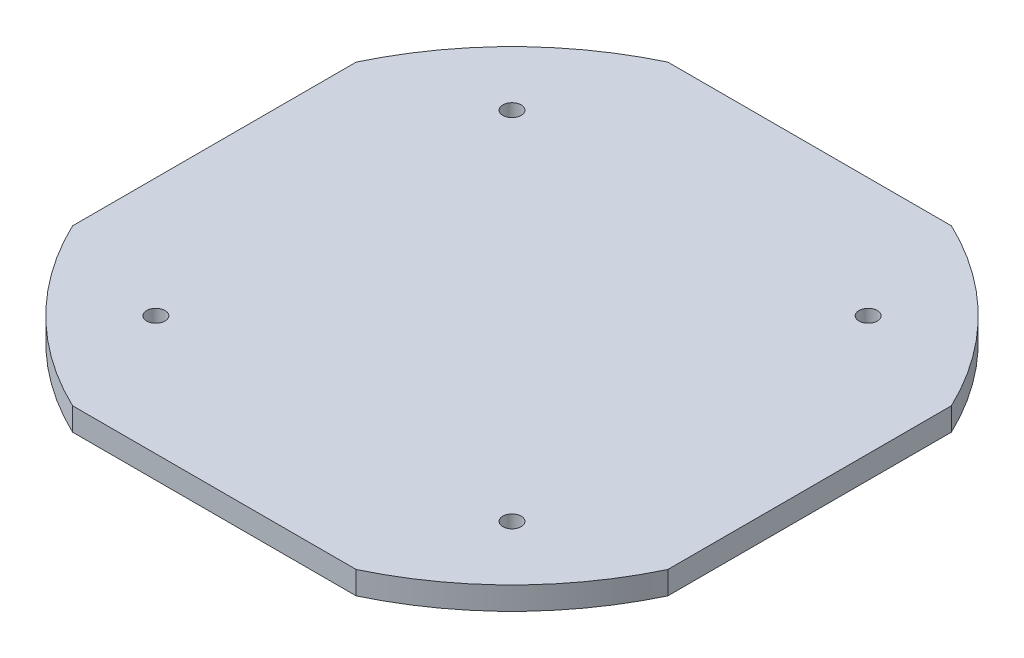
ISO-10303-21;
HEADER;
FILE_DESCRIPTION(('STEP AP214'),'2;1');
FILE_NAME('part.step','',(''),(''),'','','');
FILE_SCHEMA(('AUTOMOTIVE_DESIGN { 1 0 10303 214 1 1 1 1 }'));
ENDSEC;
DATA;
#1=APPLICATION_CONTEXT('core data for automotive mechanical design processes');
#2=APPLICATION_PROTOCOL_DEFINITION('international standard','automotive_design',2000,#1);
#3=PRODUCT_CONTEXT('',#1,'mechanical');
#4=PRODUCT('Part','Part','',(#3));
#5=PRODUCT_RELATED_PRODUCT_CATEGORY('part','',(#4));
#6=PRODUCT_DEFINITION_FORMATION('','',#4);
#7=PRODUCT_DEFINITION_CONTEXT('part definition',#1,'design');
#8=PRODUCT_DEFINITION('design','',#6,#7);
#9=PRODUCT_DEFINITION_SHAPE('','',#8);
#10=(LENGTH_UNIT() NAMED_UNIT(*) SI_UNIT(.MILLI.,.METRE.));
#11=(NAMED_UNIT(*) PLANE_ANGLE_UNIT() SI_UNIT($,.RADIAN.));
#12=(NAMED_UNIT(*) SI_UNIT($,.STERADIAN.) SOLID_ANGLE_UNIT());
#13=UNCERTAINTY_MEASURE_WITH_UNIT(LENGTH_MEASURE(1.E-05),#10,'distance_accuracy_value','');
#14=(GEOMETRIC_REPRESENTATION_CONTEXT(3) GLOBAL_UNCERTAINTY_ASSIGNED_CONTEXT((#13)) GLOBAL_UNIT_ASSIGNED_CONTEXT((#10,
#11,#12)) REPRESENTATION_CONTEXT('',''));
#15=CARTESIAN_POINT('',(0.,0.,0.));
#16=DIRECTION('',(0.,0.,1.));
#17=DIRECTION('',(1.,0.,0.));
#18=AXIS2_PLACEMENT_3D('',#15,#16,#17);
#19=CARTESIAN_POINT('',(0.,5.,0.));
#20=DIRECTION('',(0.,-1.,0.));
#21=DIRECTION('',(0.,0.,-1.));
#22=AXIS2_PLACEMENT_3D('',#19,#20,#21);
#23=CYLINDRICAL_SURFACE('',#22,72.);
#24=CARTESIAN_POINT('',(0.,0.,0.));
#25=DIRECTION('',(0.,1.,0.));
#26=DIRECTION('',(0.,0.,1.));
#27=AXIS2_PLACEMENT_3D('',#24,#25,#26);
#28=CIRCLE('',#27,72.);
#29=CARTESIAN_POINT('',(30.967725134404,0.,65.));
#30=VERTEX_POINT('',#29);
#31=CARTESIAN_POINT('',(65.,0.,30.967725134404));
#32=VERTEX_POINT('',#31);
#33=EDGE_CURVE('E132',#30,#32,#28,.T.);
#34=ORIENTED_EDGE('',*,*,#33,.T.);
#35=DIRECTION('',(0.,-1.,0.));
#36=VECTOR('',#35,1.);
#37=CARTESIAN_POINT('',(65.,5.,30.967725134404));
#38=LINE('',#37,#36);
#39=CARTESIAN_POINT('',(65.,5.,30.967725134404));
#40=VERTEX_POINT('',#39);
#41=EDGE_CURVE('E11',#40,#32,#38,.T.);
#42=ORIENTED_EDGE('',*,*,#41,.F.);
#43=CARTESIAN_POINT('',(0.,5.,0.));
#44=DIRECTION('',(0.,1.,0.));
#45=DIRECTION('',(0.,0.,1.));
#46=AXIS2_PLACEMENT_3D('',#43,#44,#45);
#47=CIRCLE('',#46,72.);
#48=CARTESIAN_POINT('',(30.967725134404,5.,65.));
#49=VERTEX_POINT('',#48);
#50=EDGE_CURVE('E147',#49,#40,#47,.T.);
#51=ORIENTED_EDGE('',*,*,#50,.F.);
#52=DIRECTION('',(0.,-1.,0.));
#53=VECTOR('',#52,1.);
#54=CARTESIAN_POINT('',(30.967725134404,5.,65.));
#55=LINE('',#54,#53);
#56=EDGE_CURVE('E128',#49,#30,#55,.T.);
#57=ORIENTED_EDGE('',*,*,#56,.T.);
#58=EDGE_LOOP('',(#34,#42,#51,#57));
#59=FACE_BOUND('',#58,.T.);
#60=ADVANCED_FACE('F36',(#59),#23,.T.);
#61=CARTESIAN_POINT('',(65.,5.,-30.967725134404));
#62=DIRECTION('',(-1.,0.,0.));
#63=DIRECTION('',(0.,0.,1.));
#64=AXIS2_PLACEMENT_3D('',#61,#62,#63);
#65=PLANE('',#64);
#66=DIRECTION('',(0.,0.,-1.));
#67=VECTOR('',#66,1.);
#68=CARTESIAN_POINT('',(65.,0.,-30.967725134404));
#69=LINE('',#68,#67);
#70=CARTESIAN_POINT('',(65.,0.,-30.967725134404));
#71=VERTEX_POINT('',#70);
#72=EDGE_CURVE('E135',#32,#71,#69,.T.);
#73=ORIENTED_EDGE('',*,*,#72,.T.);
#74=DIRECTION('',(0.,-1.,0.));
#75=VECTOR('',#74,1.);
#76=CARTESIAN_POINT('',(65.,5.,-30.967725134404));
#77=LINE('',#76,#75);
#78=CARTESIAN_POINT('',(65.,5.,-30.967725134404));
#79=VERTEX_POINT('',#78);
#80=EDGE_CURVE('E44',#79,#71,#77,.T.);
#81=ORIENTED_EDGE('',*,*,#80,.F.);
#82=DIRECTION('',(0.,0.,-1.));
#83=VECTOR('',#82,1.);
#84=CARTESIAN_POINT('',(65.,5.,-30.967725134404));
#85=LINE('',#84,#83);
#86=EDGE_CURVE('E95',#40,#79,#85,.T.);
#87=ORIENTED_EDGE('',*,*,#86,.F.);
#88=ORIENTED_EDGE('',*,*,#41,.T.);
#89=EDGE_LOOP('',(#73,#81,#87,#88));
#90=FACE_BOUND('',#89,.T.);
#91=ADVANCED_FACE('F232',(#90),#65,.F.);
#92=CARTESIAN_POINT('',(0.,5.,0.));
#93=DIRECTION('',(0.,-1.,0.));
#94=DIRECTION('',(0.,0.,-1.));
#95=AXIS2_PLACEMENT_3D('',#92,#93,#94);
#96=CYLINDRICAL_SURFACE('',#95,72.);
#97=CARTESIAN_POINT('',(0.,0.,0.));
#98=DIRECTION('',(0.,1.,0.));
#99=DIRECTION('',(0.,0.,1.));
#100=AXIS2_PLACEMENT_3D('',#97,#98,#99);
#101=CIRCLE('',#100,72.);
#102=CARTESIAN_POINT('',(30.967725134404,0.,-65.));
#103=VERTEX_POINT('',#102);
#104=EDGE_CURVE('E138',#71,#103,#101,.T.);
#105=ORIENTED_EDGE('',*,*,#104,.T.);
#106=DIRECTION('',(0.,-1.,0.));
#107=VECTOR('',#106,1.);
#108=CARTESIAN_POINT('',(30.967725134404,5.,-65.));
#109=LINE('',#108,#107);
#110=CARTESIAN_POINT('',(30.967725134404,5.,-65.));
#111=VERTEX_POINT('',#110);
#112=EDGE_CURVE('E154',#111,#103,#109,.T.);
#113=ORIENTED_EDGE('',*,*,#112,.F.);
#114=CARTESIAN_POINT('',(0.,5.,0.));
#115=DIRECTION('',(0.,1.,0.));
#116=DIRECTION('',(0.,0.,1.));
#117=AXIS2_PLACEMENT_3D('',#114,#115,#116);
#118=CIRCLE('',#117,72.);
#119=EDGE_CURVE('E162',#79,#111,#118,.T.);
#120=ORIENTED_EDGE('',*,*,#119,.F.);
#121=ORIENTED_EDGE('',*,*,#80,.T.);
#122=EDGE_LOOP('',(#105,#113,#120,#121));
#123=FACE_BOUND('',#122,.T.);
#124=ADVANCED_FACE('F160',(#123),#96,.T.);
#125=CARTESIAN_POINT('',(-30.967725134404,5.,-65.));
#126=DIRECTION('',(0.,0.,1.));
#127=DIRECTION('',(1.,0.,0.));
#128=AXIS2_PLACEMENT_3D('',#125,#126,#127);
#129=PLANE('',#128);
#130=DIRECTION('',(-1.,0.,0.));
#131=VECTOR('',#130,1.);
#132=CARTESIAN_POINT('',(-30.967725134404,0.,-65.));
#133=LINE('',#132,#131);
#134=CARTESIAN_POINT('',(-30.967725134404,0.,-65.));
#135=VERTEX_POINT('',#134);
#136=EDGE_CURVE('E140',#103,#135,#133,.T.);
#137=ORIENTED_EDGE('',*,*,#136,.T.);
#138=DIRECTION('',(0.,-1.,0.));
#139=VECTOR('',#138,1.);
#140=CARTESIAN_POINT('',(-30.967725134404,5.,-65.));
#141=LINE('',#140,#139);
#142=CARTESIAN_POINT('',(-30.967725134404,5.,-65.));
#143=VERTEX_POINT('',#142);
#144=EDGE_CURVE('E151',#143,#135,#141,.T.);
#145=ORIENTED_EDGE('',*,*,#144,.F.);
#146=DIRECTION('',(-1.,0.,0.));
#147=VECTOR('',#146,1.);
#148=CARTESIAN_POINT('',(-30.967725134404,5.,-65.));
#149=LINE('',#148,#147);
#150=EDGE_CURVE('E174',#111,#143,#149,.T.);
#151=ORIENTED_EDGE('',*,*,#150,.F.);
#152=ORIENTED_EDGE('',*,*,#112,.T.);
#153=EDGE_LOOP('',(#137,#145,#151,#152));
#154=FACE_BOUND('',#153,.T.);
#155=ADVANCED_FACE('F170',(#154),#129,.F.);
#156=CARTESIAN_POINT('',(0.,5.,0.));
#157=DIRECTION('',(0.,-1.,0.));
#158=DIRECTION('',(0.,0.,-1.));
#159=AXIS2_PLACEMENT_3D('',#156,#157,#158);
#160=CYLINDRICAL_SURFACE('',#159,72.);
#161=CARTESIAN_POINT('',(0.,0.,0.));
#162=DIRECTION('',(0.,1.,0.));
#163=DIRECTION('',(0.,0.,1.));
#164=AXIS2_PLACEMENT_3D('',#161,#162,#163);
#165=CIRCLE('',#164,72.);
#166=CARTESIAN_POINT('',(-65.,0.,-30.967725134404));
#167=VERTEX_POINT('',#166);
#168=EDGE_CURVE('E142',#135,#167,#165,.T.);
#169=ORIENTED_EDGE('',*,*,#168,.T.);
#170=DIRECTION('',(0.,-1.,0.));
#171=VECTOR('',#170,1.);
#172=CARTESIAN_POINT('',(-65.,5.,-30.967725134404));
#173=LINE('',#172,#171);
#174=CARTESIAN_POINT('',(-65.,5.,-30.967725134404));
#175=VERTEX_POINT('',#174);
#176=EDGE_CURVE('E123',#175,#167,#173,.T.);
#177=ORIENTED_EDGE('',*,*,#176,.F.);
#178=CARTESIAN_POINT('',(0.,5.,0.));
#179=DIRECTION('',(0.,1.,0.));
#180=DIRECTION('',(0.,0.,1.));
#181=AXIS2_PLACEMENT_3D('',#178,#179,#180);
#182=CIRCLE('',#181,72.);
#183=EDGE_CURVE('E114',#143,#175,#182,.T.);
#184=ORIENTED_EDGE('',*,*,#183,.F.);
#185=ORIENTED_EDGE('',*,*,#144,.T.);
#186=EDGE_LOOP('',(#169,#177,#184,#185));
#187=FACE_BOUND('',#186,.T.);
#188=ADVANCED_FACE('F173',(#187),#160,.T.);
#189=CARTESIAN_POINT('',(-65.,5.,30.9677251344041));
#190=DIRECTION('',(1.,0.,0.));
#191=DIRECTION('',(0.,0.,-1.));
#192=AXIS2_PLACEMENT_3D('',#189,#190,#191);
#193=PLANE('',#192);
#194=DIRECTION('',(0.,0.,1.));
#195=VECTOR('',#194,1.);
#196=CARTESIAN_POINT('',(-65.,0.,30.9677251344041));
#197=LINE('',#196,#195);
#198=CARTESIAN_POINT('',(-65.,0.,30.9677251344041));
#199=VERTEX_POINT('',#198);
#200=EDGE_CURVE('E122',#167,#199,#197,.T.);
#201=ORIENTED_EDGE('',*,*,#200,.T.);
#202=DIRECTION('',(0.,-1.,0.));
#203=VECTOR('',#202,1.);
#204=CARTESIAN_POINT('',(-65.,5.,30.9677251344041));
#205=LINE('',#204,#203);
#206=CARTESIAN_POINT('',(-65.,5.,30.9677251344041));
#207=VERTEX_POINT('',#206);
#208=EDGE_CURVE('E119',#207,#199,#205,.T.);
#209=ORIENTED_EDGE('',*,*,#208,.F.);
#210=DIRECTION('',(0.,0.,1.));
#211=VECTOR('',#210,1.);
#212=CARTESIAN_POINT('',(-65.,5.,30.9677251344041));
#213=LINE('',#212,#211);
#214=EDGE_CURVE('E108',#175,#207,#213,.T.);
#215=ORIENTED_EDGE('',*,*,#214,.F.);
#216=ORIENTED_EDGE('',*,*,#176,.T.);
#217=EDGE_LOOP('',(#201,#209,#215,#216));
#218=FACE_BOUND('',#217,.T.);
#219=ADVANCED_FACE('F120',(#218),#193,.F.);
#220=CARTESIAN_POINT('',(0.,5.,0.));
#221=DIRECTION('',(0.,-1.,0.));
#222=DIRECTION('',(0.,0.,-1.));
#223=AXIS2_PLACEMENT_3D('',#220,#221,#222);
#224=CYLINDRICAL_SURFACE('',#223,72.);
#225=CARTESIAN_POINT('',(0.,0.,0.));
#226=DIRECTION('',(0.,1.,0.));
#227=DIRECTION('',(0.,0.,1.));
#228=AXIS2_PLACEMENT_3D('',#225,#226,#227);
#229=CIRCLE('',#228,72.);
#230=CARTESIAN_POINT('',(-30.967725134404,0.,65.));
#231=VERTEX_POINT('',#230);
#232=EDGE_CURVE('E81',#199,#231,#229,.T.);
#233=ORIENTED_EDGE('',*,*,#232,.T.);
#234=DIRECTION('',(0.,-1.,0.));
#235=VECTOR('',#234,1.);
#236=CARTESIAN_POINT('',(-30.967725134404,5.,65.));
#237=LINE('',#236,#235);
#238=CARTESIAN_POINT('',(-30.967725134404,5.,65.));
#239=VERTEX_POINT('',#238);
#240=EDGE_CURVE('E124',#239,#231,#237,.T.);
#241=ORIENTED_EDGE('',*,*,#240,.F.);
#242=CARTESIAN_POINT('',(0.,5.,0.));
#243=DIRECTION('',(0.,1.,0.));
#244=DIRECTION('',(0.,0.,1.));
#245=AXIS2_PLACEMENT_3D('',#242,#243,#244);
#246=CIRCLE('',#245,72.);
#247=EDGE_CURVE('E112',#207,#239,#246,.T.);
#248=ORIENTED_EDGE('',*,*,#247,.F.);
#249=ORIENTED_EDGE('',*,*,#208,.T.);
#250=EDGE_LOOP('',(#233,#241,#248,#249));
#251=FACE_BOUND('',#250,.T.);
#252=ADVANCED_FACE('F126',(#251),#224,.T.);
#253=CARTESIAN_POINT('',(30.967725134404,5.,65.));
#254=DIRECTION('',(0.,0.,-1.));
#255=DIRECTION('',(-1.,0.,0.));
#256=AXIS2_PLACEMENT_3D('',#253,#254,#255);
#257=PLANE('',#256);
#258=DIRECTION('',(1.,0.,0.));
#259=VECTOR('',#258,1.);
#260=CARTESIAN_POINT('',(30.967725134404,0.,65.));
#261=LINE('',#260,#259);
#262=EDGE_CURVE('E87',#231,#30,#261,.T.);
#263=ORIENTED_EDGE('',*,*,#262,.T.);
#264=ORIENTED_EDGE('',*,*,#56,.F.);
#265=DIRECTION('',(1.,0.,0.));
#266=VECTOR('',#265,1.);
#267=CARTESIAN_POINT('',(30.967725134404,5.,65.));
#268=LINE('',#267,#266);
#269=EDGE_CURVE('E52',#239,#49,#268,.T.);
#270=ORIENTED_EDGE('',*,*,#269,.F.);
#271=ORIENTED_EDGE('',*,*,#240,.T.);
#272=EDGE_LOOP('',(#263,#264,#270,#271));
#273=FACE_BOUND('',#272,.T.);
#274=ADVANCED_FACE('F208',(#273),#257,.F.);
#275=CARTESIAN_POINT('',(0.,5.,0.));
#276=DIRECTION('',(0.,1.,0.));
#277=DIRECTION('',(0.,0.,1.));
#278=AXIS2_PLACEMENT_3D('',#275,#276,#277);
#279=PLANE('',#278);
#280=CARTESIAN_POINT('',(38.8908729652599,5.,-38.8908729652603));
#281=DIRECTION('',(0.,1.,0.));
#282=DIRECTION('',(0.,0.,1.));
#283=AXIS2_PLACEMENT_3D('',#280,#281,#282);
#284=CIRCLE('',#283,1.99999999999999);
#285=CARTESIAN_POINT('',(38.8908729652599,5.,-36.8908729652603));
#286=VERTEX_POINT('',#285);
#287=EDGE_CURVE('E200',#286,#286,#284,.T.);
#288=ORIENTED_EDGE('',*,*,#287,.F.);
#289=EDGE_LOOP('',(#288));
#290=FACE_BOUND('',#289,.T.);
#291=CARTESIAN_POINT('',(38.8908729652603,5.,38.8908729652599));
#292=DIRECTION('',(0.,1.,0.));
#293=DIRECTION('',(0.,0.,1.));
#294=AXIS2_PLACEMENT_3D('',#291,#292,#293);
#295=CIRCLE('',#294,1.99999999999999);
#296=CARTESIAN_POINT('',(38.8908729652603,5.,40.8908729652599));
#297=VERTEX_POINT('',#296);
#298=EDGE_CURVE('E194',#297,#297,#295,.T.);
#299=ORIENTED_EDGE('',*,*,#298,.F.);
#300=EDGE_LOOP('',(#299));
#301=FACE_BOUND('',#300,.T.);
#302=CARTESIAN_POINT('',(-38.8908729652599,5.,38.8908729652603));
#303=DIRECTION('',(0.,1.,0.));
#304=DIRECTION('',(0.,0.,1.));
#305=AXIS2_PLACEMENT_3D('',#302,#303,#304);
#306=CIRCLE('',#305,1.99999999999999);
#307=CARTESIAN_POINT('',(-38.8908729652599,5.,40.8908729652603));
#308=VERTEX_POINT('',#307);
#309=EDGE_CURVE('E188',#308,#308,#306,.T.);
#310=ORIENTED_EDGE('',*,*,#309,.F.);
#311=EDGE_LOOP('',(#310));
#312=FACE_BOUND('',#311,.T.);
#313=CARTESIAN_POINT('',(-38.8908729652603,5.,-38.8908729652599));
#314=DIRECTION('',(0.,1.,0.));
#315=DIRECTION('',(0.,0.,1.));
#316=AXIS2_PLACEMENT_3D('',#313,#314,#315);
#317=CIRCLE('',#316,1.99999999999999);
#318=CARTESIAN_POINT('',(-38.8908729652603,5.,-36.8908729652599));
#319=VERTEX_POINT('',#318);
#320=EDGE_CURVE('E182',#319,#319,#317,.T.);
#321=ORIENTED_EDGE('',*,*,#320,.F.);
#322=EDGE_LOOP('',(#321));
#323=FACE_BOUND('',#322,.T.);
#324=ORIENTED_EDGE('',*,*,#50,.T.);
#325=ORIENTED_EDGE('',*,*,#86,.T.);
#326=ORIENTED_EDGE('',*,*,#119,.T.);
#327=ORIENTED_EDGE('',*,*,#150,.T.);
#328=ORIENTED_EDGE('',*,*,#183,.T.);
#329=ORIENTED_EDGE('',*,*,#214,.T.);
#330=ORIENTED_EDGE('',*,*,#247,.T.);
#331=ORIENTED_EDGE('',*,*,#269,.T.);
#332=EDGE_LOOP('',(#324,#325,#326,#327,#328,#329,#330,#331));
#333=FACE_BOUND('',#332,.T.);
#334=ADVANCED_FACE('F110',(#290,#301,#312,#323,#333),#279,.T.);
#335=CARTESIAN_POINT('',(0.,0.,0.));
#336=DIRECTION('',(0.,1.,0.));
#337=DIRECTION('',(0.,0.,1.));
#338=AXIS2_PLACEMENT_3D('',#335,#336,#337);
#339=PLANE('',#338);
#340=CARTESIAN_POINT('',(38.8908729652599,0.,-38.8908729652603));
#341=DIRECTION('',(0.,1.,0.));
#342=DIRECTION('',(0.,0.,1.));
#343=AXIS2_PLACEMENT_3D('',#340,#341,#342);
#344=CIRCLE('',#343,1.99999999999999);
#345=CARTESIAN_POINT('',(38.8908729652599,0.,-36.8908729652603));
#346=VERTEX_POINT('',#345);
#347=EDGE_CURVE('E197',#346,#346,#344,.T.);
#348=ORIENTED_EDGE('',*,*,#347,.T.);
#349=EDGE_LOOP('',(#348));
#350=FACE_BOUND('',#349,.T.);
#351=CARTESIAN_POINT('',(38.8908729652603,0.,38.8908729652599));
#352=DIRECTION('',(0.,1.,0.));
#353=DIRECTION('',(0.,0.,1.));
#354=AXIS2_PLACEMENT_3D('',#351,#352,#353);
#355=CIRCLE('',#354,1.99999999999999);
#356=CARTESIAN_POINT('',(38.8908729652603,0.,40.8908729652599));
#357=VERTEX_POINT('',#356);
#358=EDGE_CURVE('E191',#357,#357,#355,.T.);
#359=ORIENTED_EDGE('',*,*,#358,.T.);
#360=EDGE_LOOP('',(#359));
#361=FACE_BOUND('',#360,.T.);
#362=CARTESIAN_POINT('',(-38.8908729652599,0.,38.8908729652603));
#363=DIRECTION('',(0.,1.,0.));
#364=DIRECTION('',(0.,0.,1.));
#365=AXIS2_PLACEMENT_3D('',#362,#363,#364);
#366=CIRCLE('',#365,1.99999999999999);
#367=CARTESIAN_POINT('',(-38.8908729652599,0.,40.8908729652603));
#368=VERTEX_POINT('',#367);
#369=EDGE_CURVE('E185',#368,#368,#366,.T.);
#370=ORIENTED_EDGE('',*,*,#369,.T.);
#371=EDGE_LOOP('',(#370));
#372=FACE_BOUND('',#371,.T.);
#373=CARTESIAN_POINT('',(-38.8908729652603,0.,-38.8908729652599));
#374=DIRECTION('',(0.,1.,0.));
#375=DIRECTION('',(0.,0.,1.));
#376=AXIS2_PLACEMENT_3D('',#373,#374,#375);
#377=CIRCLE('',#376,1.99999999999999);
#378=CARTESIAN_POINT('',(-38.8908729652603,0.,-36.8908729652599));
#379=VERTEX_POINT('',#378);
#380=EDGE_CURVE('E136',#379,#379,#377,.T.);
#381=ORIENTED_EDGE('',*,*,#380,.T.);
#382=EDGE_LOOP('',(#381));
#383=FACE_BOUND('',#382,.T.);
#384=ORIENTED_EDGE('',*,*,#33,.F.);
#385=ORIENTED_EDGE('',*,*,#262,.F.);
#386=ORIENTED_EDGE('',*,*,#232,.F.);
#387=ORIENTED_EDGE('',*,*,#200,.F.);
#388=ORIENTED_EDGE('',*,*,#168,.F.);
#389=ORIENTED_EDGE('',*,*,#136,.F.);
#390=ORIENTED_EDGE('',*,*,#104,.F.);
#391=ORIENTED_EDGE('',*,*,#72,.F.);
#392=EDGE_LOOP('',(#384,#385,#386,#387,#388,#389,#390,#391));
#393=FACE_BOUND('',#392,.T.);
#394=ADVANCED_FACE('F166',(#350,#361,#372,#383,#393),#339,.F.);
#395=CARTESIAN_POINT('',(-38.8908729652603,5.,-38.8908729652599));
#396=DIRECTION('',(0.,1.,0.));
#397=DIRECTION('',(0.,0.,1.));
#398=AXIS2_PLACEMENT_3D('',#395,#396,#397);
#399=CYLINDRICAL_SURFACE('',#398,1.99999999999999);
#400=ORIENTED_EDGE('',*,*,#380,.F.);
#401=EDGE_LOOP('',(#400));
#402=FACE_BOUND('',#401,.T.);
#403=ORIENTED_EDGE('',*,*,#320,.T.);
#404=EDGE_LOOP('',(#403));
#405=FACE_BOUND('',#404,.T.);
#406=ADVANCED_FACE('F216',(#402,#405),#399,.F.);
#407=CARTESIAN_POINT('',(-38.8908729652599,5.,38.8908729652603));
#408=DIRECTION('',(0.,1.,0.));
#409=DIRECTION('',(0.,0.,1.));
#410=AXIS2_PLACEMENT_3D('',#407,#408,#409);
#411=CYLINDRICAL_SURFACE('',#410,1.99999999999999);
#412=ORIENTED_EDGE('',*,*,#369,.F.);
#413=EDGE_LOOP('',(#412));
#414=FACE_BOUND('',#413,.T.);
#415=ORIENTED_EDGE('',*,*,#309,.T.);
#416=EDGE_LOOP('',(#415));
#417=FACE_BOUND('',#416,.T.);
#418=ADVANCED_FACE('F218',(#414,#417),#411,.F.);
#419=CARTESIAN_POINT('',(38.8908729652603,5.,38.8908729652599));
#420=DIRECTION('',(0.,1.,0.));
#421=DIRECTION('',(0.,0.,1.));
#422=AXIS2_PLACEMENT_3D('',#419,#420,#421);
#423=CYLINDRICAL_SURFACE('',#422,1.99999999999999);
#424=ORIENTED_EDGE('',*,*,#358,.F.);
#425=EDGE_LOOP('',(#424));
#426=FACE_BOUND('',#425,.T.);
#427=ORIENTED_EDGE('',*,*,#298,.T.);
#428=EDGE_LOOP('',(#427));
#429=FACE_BOUND('',#428,.T.);
#430=ADVANCED_FACE('F225',(#426,#429),#423,.F.);
#431=CARTESIAN_POINT('',(38.8908729652599,5.,-38.8908729652603));
#432=DIRECTION('',(0.,1.,0.));
#433=DIRECTION('',(0.,0.,1.));
#434=AXIS2_PLACEMENT_3D('',#431,#432,#433);
#435=CYLINDRICAL_SURFACE('',#434,1.99999999999999);
#436=ORIENTED_EDGE('',*,*,#347,.F.);
#437=EDGE_LOOP('',(#436));
#438=FACE_BOUND('',#437,.T.);
#439=ORIENTED_EDGE('',*,*,#287,.T.);
#440=EDGE_LOOP('',(#439));
#441=FACE_BOUND('',#440,.T.);
#442=ADVANCED_FACE('F204',(#438,#441),#435,.F.);
#443=CLOSED_SHELL('',(#60,#91,#124,#155,#188,#219,#252,#274,#334,#394,#406,#418,#430,#442));
#444=MANIFOLD_SOLID_BREP('B2',#443);
#445=ADVANCED_BREP_SHAPE_REPRESENTATION('',(#18,#444),#14);
#446=SHAPE_DEFINITION_REPRESENTATION(#9,#445);
ENDSEC;
END-ISO-10303-21;
